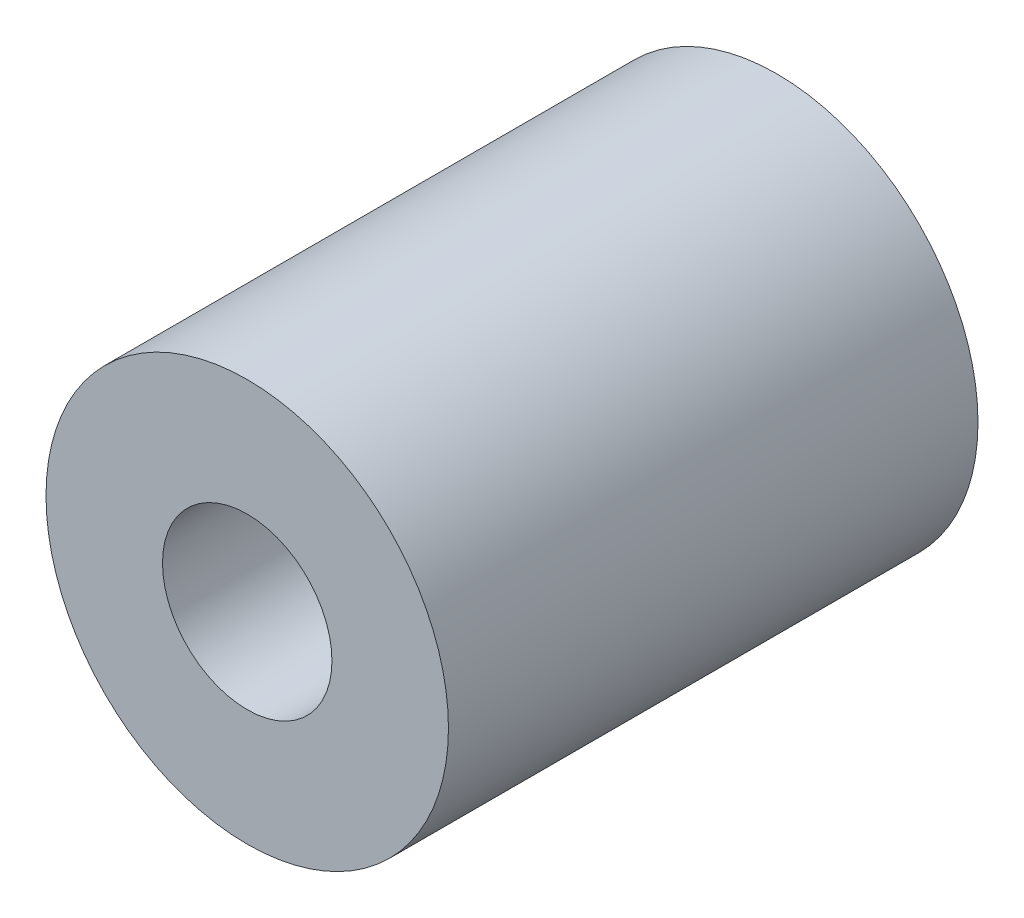
ISO-10303-21;
HEADER;
FILE_DESCRIPTION(('STEP AP214'),'2;1');
FILE_NAME('part.step','',(''),(''),'','','');
FILE_SCHEMA(('AUTOMOTIVE_DESIGN { 1 0 10303 214 1 1 1 1 }'));
ENDSEC;
DATA;
#1=APPLICATION_CONTEXT('core data for automotive mechanical design processes');
#2=APPLICATION_PROTOCOL_DEFINITION('international standard','automotive_design',2000,#1);
#3=PRODUCT_CONTEXT('',#1,'mechanical');
#4=PRODUCT('Part','Part','',(#3));
#5=PRODUCT_RELATED_PRODUCT_CATEGORY('part','',(#4));
#6=PRODUCT_DEFINITION_FORMATION('','',#4);
#7=PRODUCT_DEFINITION_CONTEXT('part definition',#1,'design');
#8=PRODUCT_DEFINITION('design','',#6,#7);
#9=PRODUCT_DEFINITION_SHAPE('','',#8);
#10=(LENGTH_UNIT() NAMED_UNIT(*) SI_UNIT(.MILLI.,.METRE.));
#11=(NAMED_UNIT(*) PLANE_ANGLE_UNIT() SI_UNIT($,.RADIAN.));
#12=(NAMED_UNIT(*) SI_UNIT($,.STERADIAN.) SOLID_ANGLE_UNIT());
#13=UNCERTAINTY_MEASURE_WITH_UNIT(LENGTH_MEASURE(1.E-05),#10,'distance_accuracy_value','');
#14=(GEOMETRIC_REPRESENTATION_CONTEXT(3) GLOBAL_UNCERTAINTY_ASSIGNED_CONTEXT((#13)) GLOBAL_UNIT_ASSIGNED_CONTEXT((#10,
#11,#12)) REPRESENTATION_CONTEXT('',''));
#15=CARTESIAN_POINT('',(0.,0.,0.));
#16=DIRECTION('',(0.,0.,1.));
#17=DIRECTION('',(1.,0.,0.));
#18=AXIS2_PLACEMENT_3D('',#15,#16,#17);
#19=CARTESIAN_POINT('',(0.,0.,25.));
#20=DIRECTION('',(0.,0.,-1.));
#21=DIRECTION('',(-1.,0.,0.));
#22=AXIS2_PLACEMENT_3D('',#19,#20,#21);
#23=CYLINDRICAL_SURFACE('',#22,9.5);
#24=CARTESIAN_POINT('',(0.,0.,25.));
#25=DIRECTION('',(0.,0.,1.));
#26=DIRECTION('',(1.,0.,0.));
#27=AXIS2_PLACEMENT_3D('',#24,#25,#26);
#28=CIRCLE('',#27,9.5);
#29=CARTESIAN_POINT('',(9.5,0.,25.));
#30=VERTEX_POINT('',#29);
#31=EDGE_CURVE('E10',#30,#30,#28,.T.);
#32=ORIENTED_EDGE('',*,*,#31,.F.);
#33=EDGE_LOOP('',(#32));
#34=FACE_BOUND('',#33,.T.);
#35=CARTESIAN_POINT('',(0.,0.,0.));
#36=DIRECTION('',(0.,0.,1.));
#37=DIRECTION('',(1.,0.,0.));
#38=AXIS2_PLACEMENT_3D('',#35,#36,#37);
#39=CIRCLE('',#38,9.5);
#40=CARTESIAN_POINT('',(9.5,0.,0.));
#41=VERTEX_POINT('',#40);
#42=EDGE_CURVE('E35',#41,#41,#39,.T.);
#43=ORIENTED_EDGE('',*,*,#42,.T.);
#44=EDGE_LOOP('',(#43));
#45=FACE_BOUND('',#44,.T.);
#46=ADVANCED_FACE('F32',(#34,#45),#23,.T.);
#47=CARTESIAN_POINT('',(0.,0.,25.));
#48=DIRECTION('',(0.,0.,1.));
#49=DIRECTION('',(1.,0.,0.));
#50=AXIS2_PLACEMENT_3D('',#47,#48,#49);
#51=PLANE('',#50);
#52=CARTESIAN_POINT('',(0.,0.,25.));
#53=DIRECTION('',(0.,0.,1.));
#54=DIRECTION('',(1.,0.,0.));
#55=AXIS2_PLACEMENT_3D('',#52,#53,#54);
#56=CIRCLE('',#55,4.);
#57=CARTESIAN_POINT('',(4.,0.,25.));
#58=VERTEX_POINT('',#57);
#59=EDGE_CURVE('E44',#58,#58,#56,.T.);
#60=ORIENTED_EDGE('',*,*,#59,.F.);
#61=EDGE_LOOP('',(#60));
#62=FACE_BOUND('',#61,.T.);
#63=ORIENTED_EDGE('',*,*,#31,.T.);
#64=EDGE_LOOP('',(#63));
#65=FACE_BOUND('',#64,.T.);
#66=ADVANCED_FACE('F69',(#62,#65),#51,.T.);
#67=CARTESIAN_POINT('',(0.,0.,0.));
#68=DIRECTION('',(0.,0.,1.));
#69=DIRECTION('',(1.,0.,0.));
#70=AXIS2_PLACEMENT_3D('',#67,#68,#69);
#71=PLANE('',#70);
#72=CARTESIAN_POINT('',(0.,0.,0.));
#73=DIRECTION('',(0.,0.,-1.));
#74=DIRECTION('',(-1.,0.,0.));
#75=AXIS2_PLACEMENT_3D('',#72,#73,#74);
#76=CIRCLE('',#75,2.5);
#77=CARTESIAN_POINT('',(-2.5,0.,0.));
#78=VERTEX_POINT('',#77);
#79=EDGE_CURVE('E50',#78,#78,#76,.T.);
#80=ORIENTED_EDGE('',*,*,#79,.F.);
#81=EDGE_LOOP('',(#80));
#82=FACE_BOUND('',#81,.T.);
#83=ORIENTED_EDGE('',*,*,#42,.F.);
#84=EDGE_LOOP('',(#83));
#85=FACE_BOUND('',#84,.T.);
#86=ADVANCED_FACE('F65',(#82,#85),#71,.F.);
#87=CARTESIAN_POINT('',(0.,0.,13.));
#88=DIRECTION('',(0.,0.,1.));
#89=DIRECTION('',(1.,0.,0.));
#90=AXIS2_PLACEMENT_3D('',#87,#88,#89);
#91=CYLINDRICAL_SURFACE('',#90,4.);
#92=CARTESIAN_POINT('',(0.,0.,13.));
#93=DIRECTION('',(0.,0.,1.));
#94=DIRECTION('',(1.,0.,0.));
#95=AXIS2_PLACEMENT_3D('',#92,#93,#94);
#96=CIRCLE('',#95,4.);
#97=CARTESIAN_POINT('',(4.,0.,13.));
#98=VERTEX_POINT('',#97);
#99=EDGE_CURVE('E42',#98,#98,#96,.T.);
#100=ORIENTED_EDGE('',*,*,#99,.F.);
#101=EDGE_LOOP('',(#100));
#102=FACE_BOUND('',#101,.T.);
#103=ORIENTED_EDGE('',*,*,#59,.T.);
#104=EDGE_LOOP('',(#103));
#105=FACE_BOUND('',#104,.T.);
#106=ADVANCED_FACE('F68',(#102,#105),#91,.F.);
#107=CARTESIAN_POINT('',(0.,0.,13.));
#108=DIRECTION('',(0.,0.,1.));
#109=DIRECTION('',(1.,0.,0.));
#110=AXIS2_PLACEMENT_3D('',#107,#108,#109);
#111=PLANE('',#110);
#112=CARTESIAN_POINT('',(0.,0.,13.));
#113=DIRECTION('',(0.,0.,-1.));
#114=DIRECTION('',(-1.,0.,0.));
#115=AXIS2_PLACEMENT_3D('',#112,#113,#114);
#116=CIRCLE('',#115,2.5);
#117=CARTESIAN_POINT('',(-2.5,0.,13.));
#118=VERTEX_POINT('',#117);
#119=EDGE_CURVE('E47',#118,#118,#116,.T.);
#120=ORIENTED_EDGE('',*,*,#119,.T.);
#121=EDGE_LOOP('',(#120));
#122=FACE_BOUND('',#121,.T.);
#123=ORIENTED_EDGE('',*,*,#99,.T.);
#124=EDGE_LOOP('',(#123));
#125=FACE_BOUND('',#124,.T.);
#126=ADVANCED_FACE('F56',(#122,#125),#111,.T.);
#127=CARTESIAN_POINT('',(0.,0.,13.));
#128=DIRECTION('',(0.,0.,-1.));
#129=DIRECTION('',(-1.,0.,0.));
#130=AXIS2_PLACEMENT_3D('',#127,#128,#129);
#131=CYLINDRICAL_SURFACE('',#130,2.5);
#132=CARTESIAN_POINT('',(-2.5,0.,13.));
#133=CARTESIAN_POINT('',(-2.5,0.,12.8645833333333));
#134=CARTESIAN_POINT('',(-2.5,0.,12.7291666666667));
#135=CARTESIAN_POINT('',(-2.5,0.,12.4583333333333));
#136=CARTESIAN_POINT('',(-2.5,0.,12.3229166666667));
#137=CARTESIAN_POINT('',(-2.5,0.,12.0520833333333));
#138=CARTESIAN_POINT('',(-2.5,0.,11.9166666666667));
#139=CARTESIAN_POINT('',(-2.5,0.,11.6458333333333));
#140=CARTESIAN_POINT('',(-2.5,0.,11.5104166666667));
#141=CARTESIAN_POINT('',(-2.5,0.,11.2395833333333));
#142=CARTESIAN_POINT('',(-2.5,0.,11.1041666666667));
#143=CARTESIAN_POINT('',(-2.5,0.,10.8333333333333));
#144=CARTESIAN_POINT('',(-2.5,0.,10.6979166666667));
#145=CARTESIAN_POINT('',(-2.5,0.,10.4270833333333));
#146=CARTESIAN_POINT('',(-2.5,0.,10.2916666666667));
#147=CARTESIAN_POINT('',(-2.5,0.,10.0208333333333));
#148=CARTESIAN_POINT('',(-2.5,0.,9.88541666666667));
#149=CARTESIAN_POINT('',(-2.5,0.,9.61458333333333));
#150=CARTESIAN_POINT('',(-2.5,0.,9.47916666666667));
#151=CARTESIAN_POINT('',(-2.5,0.,9.20833333333333));
#152=CARTESIAN_POINT('',(-2.5,0.,9.07291666666667));
#153=CARTESIAN_POINT('',(-2.5,0.,8.80208333333333));
#154=CARTESIAN_POINT('',(-2.5,0.,8.66666666666667));
#155=CARTESIAN_POINT('',(-2.5,0.,8.39583333333333));
#156=CARTESIAN_POINT('',(-2.5,0.,8.26041666666667));
#157=CARTESIAN_POINT('',(-2.5,0.,7.98958333333333));
#158=CARTESIAN_POINT('',(-2.5,0.,7.85416666666667));
#159=CARTESIAN_POINT('',(-2.5,0.,7.58333333333333));
#160=CARTESIAN_POINT('',(-2.5,0.,7.44791666666667));
#161=CARTESIAN_POINT('',(-2.5,0.,7.17708333333333));
#162=CARTESIAN_POINT('',(-2.5,0.,7.04166666666667));
#163=CARTESIAN_POINT('',(-2.5,0.,6.77083333333333));
#164=CARTESIAN_POINT('',(-2.5,0.,6.63541666666667));
#165=CARTESIAN_POINT('',(-2.5,0.,6.36458333333333));
#166=CARTESIAN_POINT('',(-2.5,0.,6.22916666666667));
#167=CARTESIAN_POINT('',(-2.5,0.,5.95833333333333));
#168=CARTESIAN_POINT('',(-2.5,0.,5.82291666666667));
#169=CARTESIAN_POINT('',(-2.5,0.,5.55208333333333));
#170=CARTESIAN_POINT('',(-2.5,0.,5.41666666666667));
#171=CARTESIAN_POINT('',(-2.5,0.,5.14583333333333));
#172=CARTESIAN_POINT('',(-2.5,0.,5.01041666666667));
#173=CARTESIAN_POINT('',(-2.5,0.,4.73958333333333));
#174=CARTESIAN_POINT('',(-2.5,0.,4.60416666666667));
#175=CARTESIAN_POINT('',(-2.5,0.,4.33333333333333));
#176=CARTESIAN_POINT('',(-2.5,0.,4.19791666666667));
#177=CARTESIAN_POINT('',(-2.5,0.,3.92708333333333));
#178=CARTESIAN_POINT('',(-2.5,0.,3.79166666666667));
#179=CARTESIAN_POINT('',(-2.5,0.,3.52083333333333));
#180=CARTESIAN_POINT('',(-2.5,0.,3.38541666666667));
#181=CARTESIAN_POINT('',(-2.5,0.,3.11458333333333));
#182=CARTESIAN_POINT('',(-2.5,0.,2.97916666666667));
#183=CARTESIAN_POINT('',(-2.5,0.,2.70833333333333));
#184=CARTESIAN_POINT('',(-2.5,0.,2.57291666666667));
#185=CARTESIAN_POINT('',(-2.5,0.,2.30208333333333));
#186=CARTESIAN_POINT('',(-2.5,0.,2.16666666666667));
#187=CARTESIAN_POINT('',(-2.5,0.,1.89583333333333));
#188=CARTESIAN_POINT('',(-2.5,0.,1.76041666666667));
#189=CARTESIAN_POINT('',(-2.5,0.,1.48958333333333));
#190=CARTESIAN_POINT('',(-2.5,0.,1.35416666666667));
#191=CARTESIAN_POINT('',(-2.5,0.,1.08333333333333));
#192=CARTESIAN_POINT('',(-2.5,0.,0.947916666666667));
#193=CARTESIAN_POINT('',(-2.5,0.,0.677083333333334));
#194=CARTESIAN_POINT('',(-2.5,0.,0.541666666666667));
#195=CARTESIAN_POINT('',(-2.5,0.,0.270833333333334));
#196=CARTESIAN_POINT('',(-2.5,0.,0.135416666666667));
#197=CARTESIAN_POINT('',(-2.5,0.,0.));
#198=B_SPLINE_CURVE_WITH_KNOTS('',3,(#132,#133,#134,#135,#136,#137,#138,#139,#140,#141,#142,
#143,#144,#145,#146,#147,#148,#149,#150,#151,#152,#153,#154,#155,#156,#157,#158,#159,#160,#161,
#162,#163,#164,#165,#166,#167,#168,#169,#170,#171,#172,#173,#174,#175,#176,#177,#178,#179,#180,
#181,#182,#183,#184,#185,#186,#187,#188,#189,#190,#191,#192,#193,#194,#195,#196,#197),
.UNSPECIFIED.,.F.,.F.,(4,2,2,2,2,2,2,2,2,2,2,2,2,2,2,2,2,2,2,2,2,2,2,2,2,2,2,2,2,2,2,2,4),(0.,
0.406249999999999,0.812499999999999,1.21875,1.625,2.03125,2.4375,2.84375,3.25,3.65625,4.0625,
4.46875,4.875,5.28125,5.6875,6.09375,6.5,6.90625,7.3125,7.71875,8.125,8.53125,8.9375,9.34375,
9.75,10.15625,10.5625,10.96875,11.375,11.78125,12.1875,12.59375,13.),.UNSPECIFIED.);
#199=EDGE_CURVE('BSEAM59',#118,#78,#198,.T.);
#200=ORIENTED_EDGE('',*,*,#119,.F.);
#201=ORIENTED_EDGE('',*,*,#79,.T.);
#202=ORIENTED_EDGE('',*,*,#199,.T.);
#203=ORIENTED_EDGE('',*,*,#199,.F.);
#204=EDGE_LOOP('',(#200,#202,#201,#203));
#205=FACE_BOUND('',#204,.T.);
#206=ADVANCED_FACE('F59',(#205),#131,.F.);
#207=CLOSED_SHELL('',(#46,#66,#86,#106,#126,#206));
#208=MANIFOLD_SOLID_BREP('B2',#207);
#209=ADVANCED_BREP_SHAPE_REPRESENTATION('',(#18,#208),#14);
#210=SHAPE_DEFINITION_REPRESENTATION(#9,#209);
ENDSEC;
END-ISO-10303-21;
